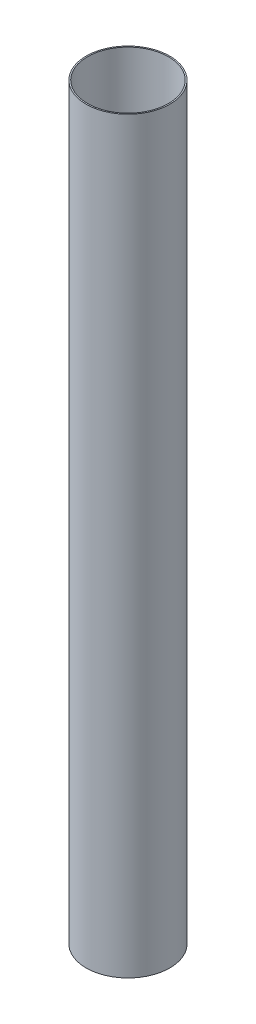
ISO-10303-21;
HEADER;
FILE_DESCRIPTION(('STEP AP214'),'2;1');
FILE_NAME('part.step','',(''),(''),'','','');
FILE_SCHEMA(('AUTOMOTIVE_DESIGN { 1 0 10303 214 1 1 1 1 }'));
ENDSEC;
DATA;
#1=APPLICATION_CONTEXT('core data for automotive mechanical design processes');
#2=APPLICATION_PROTOCOL_DEFINITION('international standard','automotive_design',2000,#1);
#3=PRODUCT_CONTEXT('',#1,'mechanical');
#4=PRODUCT('Part','Part','',(#3));
#5=PRODUCT_RELATED_PRODUCT_CATEGORY('part','',(#4));
#6=PRODUCT_DEFINITION_FORMATION('','',#4);
#7=PRODUCT_DEFINITION_CONTEXT('part definition',#1,'design');
#8=PRODUCT_DEFINITION('design','',#6,#7);
#9=PRODUCT_DEFINITION_SHAPE('','',#8);
#10=(LENGTH_UNIT() NAMED_UNIT(*) SI_UNIT(.MILLI.,.METRE.));
#11=(NAMED_UNIT(*) PLANE_ANGLE_UNIT() SI_UNIT($,.RADIAN.));
#12=(NAMED_UNIT(*) SI_UNIT($,.STERADIAN.) SOLID_ANGLE_UNIT());
#13=UNCERTAINTY_MEASURE_WITH_UNIT(LENGTH_MEASURE(1.E-05),#10,'distance_accuracy_value','');
#14=(GEOMETRIC_REPRESENTATION_CONTEXT(3) GLOBAL_UNCERTAINTY_ASSIGNED_CONTEXT((#13)) GLOBAL_UNIT_ASSIGNED_CONTEXT((#10,
#11,#12)) REPRESENTATION_CONTEXT('',''));
#15=CARTESIAN_POINT('',(0.,0.,0.));
#16=DIRECTION('',(0.,0.,1.));
#17=DIRECTION('',(1.,0.,0.));
#18=AXIS2_PLACEMENT_3D('',#15,#16,#17);
#19=CARTESIAN_POINT('',(0.,914.4,0.));
#20=DIRECTION('',(0.,-1.,0.));
#21=DIRECTION('',(0.,0.,-1.));
#22=AXIS2_PLACEMENT_3D('',#19,#20,#21);
#23=CYLINDRICAL_SURFACE('',#22,51.105);
#24=CARTESIAN_POINT('',(0.,914.4,0.));
#25=DIRECTION('',(0.,1.,0.));
#26=DIRECTION('',(0.,0.,1.));
#27=AXIS2_PLACEMENT_3D('',#24,#25,#26);
#28=CIRCLE('',#27,51.105);
#29=CARTESIAN_POINT('',(0.,914.4,51.105));
#30=VERTEX_POINT('',#29);
#31=EDGE_CURVE('E10',#30,#30,#28,.T.);
#32=ORIENTED_EDGE('',*,*,#31,.F.);
#33=EDGE_LOOP('',(#32));
#34=FACE_BOUND('',#33,.T.);
#35=CARTESIAN_POINT('',(0.,0.,0.));
#36=DIRECTION('',(0.,1.,0.));
#37=DIRECTION('',(0.,0.,1.));
#38=AXIS2_PLACEMENT_3D('',#35,#36,#37);
#39=CIRCLE('',#38,51.105);
#40=CARTESIAN_POINT('',(0.,0.,51.105));
#41=VERTEX_POINT('',#40);
#42=EDGE_CURVE('E37',#41,#41,#39,.T.);
#43=ORIENTED_EDGE('',*,*,#42,.T.);
#44=EDGE_LOOP('',(#43));
#45=FACE_BOUND('',#44,.T.);
#46=ADVANCED_FACE('F34',(#34,#45),#23,.T.);
#47=CARTESIAN_POINT('',(0.,914.4,0.));
#48=DIRECTION('',(0.,1.,0.));
#49=DIRECTION('',(0.,0.,1.));
#50=AXIS2_PLACEMENT_3D('',#47,#48,#49);
#51=PLANE('',#50);
#52=CARTESIAN_POINT('',(0.,914.4,0.));
#53=DIRECTION('',(0.,-1.,0.));
#54=DIRECTION('',(0.,0.,-1.));
#55=AXIS2_PLACEMENT_3D('',#52,#53,#54);
#56=CIRCLE('',#55,49.53);
#57=CARTESIAN_POINT('',(0.,914.4,-49.53));
#58=VERTEX_POINT('',#57);
#59=EDGE_CURVE('E44',#58,#58,#56,.T.);
#60=ORIENTED_EDGE('',*,*,#59,.T.);
#61=EDGE_LOOP('',(#60));
#62=FACE_BOUND('',#61,.T.);
#63=ORIENTED_EDGE('',*,*,#31,.T.);
#64=EDGE_LOOP('',(#63));
#65=FACE_BOUND('',#64,.T.);
#66=ADVANCED_FACE('F52',(#62,#65),#51,.T.);
#67=CARTESIAN_POINT('',(0.,0.,0.));
#68=DIRECTION('',(0.,1.,0.));
#69=DIRECTION('',(0.,0.,1.));
#70=AXIS2_PLACEMENT_3D('',#67,#68,#69);
#71=PLANE('',#70);
#72=CARTESIAN_POINT('',(0.,0.,0.));
#73=DIRECTION('',(0.,-1.,0.));
#74=DIRECTION('',(0.,0.,-1.));
#75=AXIS2_PLACEMENT_3D('',#72,#73,#74);
#76=CIRCLE('',#75,49.53);
#77=CARTESIAN_POINT('',(0.,0.,-49.53));
#78=VERTEX_POINT('',#77);
#79=EDGE_CURVE('E46',#78,#78,#76,.T.);
#80=ORIENTED_EDGE('',*,*,#79,.F.);
#81=EDGE_LOOP('',(#80));
#82=FACE_BOUND('',#81,.T.);
#83=ORIENTED_EDGE('',*,*,#42,.F.);
#84=EDGE_LOOP('',(#83));
#85=FACE_BOUND('',#84,.T.);
#86=ADVANCED_FACE('F57',(#82,#85),#71,.F.);
#87=CARTESIAN_POINT('',(0.,914.4,0.));
#88=DIRECTION('',(0.,-1.,0.));
#89=DIRECTION('',(0.,0.,-1.));
#90=AXIS2_PLACEMENT_3D('',#87,#88,#89);
#91=CYLINDRICAL_SURFACE('',#90,49.53);
#92=ORIENTED_EDGE('',*,*,#59,.F.);
#93=EDGE_LOOP('',(#92));
#94=FACE_BOUND('',#93,.T.);
#95=ORIENTED_EDGE('',*,*,#79,.T.);
#96=EDGE_LOOP('',(#95));
#97=FACE_BOUND('',#96,.T.);
#98=ADVANCED_FACE('F54',(#94,#97),#91,.F.);
#99=CLOSED_SHELL('',(#46,#66,#86,#98));
#100=MANIFOLD_SOLID_BREP('B2',#99);
#101=ADVANCED_BREP_SHAPE_REPRESENTATION('',(#18,#100),#14);
#102=SHAPE_DEFINITION_REPRESENTATION(#9,#101);
ENDSEC;
END-ISO-10303-21;
